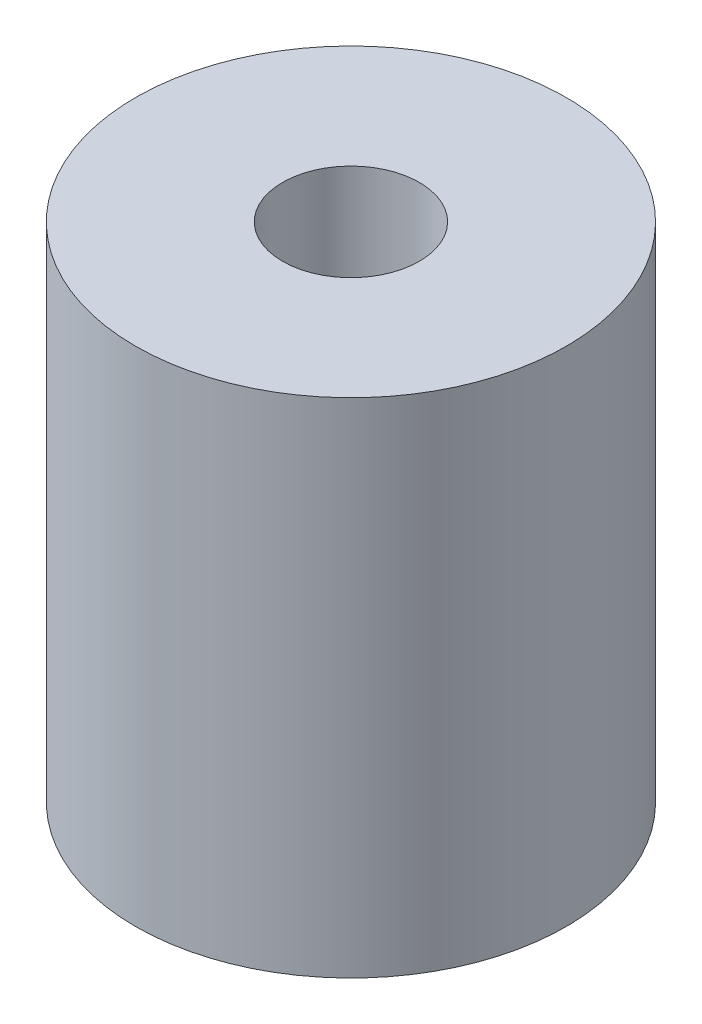
ISO-10303-21;
HEADER;
FILE_DESCRIPTION(('STEP AP214'),'2;1');
FILE_NAME('part.step','',(''),(''),'','','');
FILE_SCHEMA(('AUTOMOTIVE_DESIGN { 1 0 10303 214 1 1 1 1 }'));
ENDSEC;
DATA;
#1=APPLICATION_CONTEXT('core data for automotive mechanical design processes');
#2=APPLICATION_PROTOCOL_DEFINITION('international standard','automotive_design',2000,#1);
#3=PRODUCT_CONTEXT('',#1,'mechanical');
#4=PRODUCT('Part','Part','',(#3));
#5=PRODUCT_RELATED_PRODUCT_CATEGORY('part','',(#4));
#6=PRODUCT_DEFINITION_FORMATION('','',#4);
#7=PRODUCT_DEFINITION_CONTEXT('part definition',#1,'design');
#8=PRODUCT_DEFINITION('design','',#6,#7);
#9=PRODUCT_DEFINITION_SHAPE('','',#8);
#10=(LENGTH_UNIT() NAMED_UNIT(*) SI_UNIT(.MILLI.,.METRE.));
#11=(NAMED_UNIT(*) PLANE_ANGLE_UNIT() SI_UNIT($,.RADIAN.));
#12=(NAMED_UNIT(*) SI_UNIT($,.STERADIAN.) SOLID_ANGLE_UNIT());
#13=UNCERTAINTY_MEASURE_WITH_UNIT(LENGTH_MEASURE(1.E-05),#10,'distance_accuracy_value','');
#14=(GEOMETRIC_REPRESENTATION_CONTEXT(3) GLOBAL_UNCERTAINTY_ASSIGNED_CONTEXT((#13)) GLOBAL_UNIT_ASSIGNED_CONTEXT((#10,
#11,#12)) REPRESENTATION_CONTEXT('',''));
#15=CARTESIAN_POINT('',(0.,0.,0.));
#16=DIRECTION('',(0.,0.,1.));
#17=DIRECTION('',(1.,0.,0.));
#18=AXIS2_PLACEMENT_3D('',#15,#16,#17);
#19=CARTESIAN_POINT('',(0.,35.,0.));
#20=DIRECTION('',(0.,-1.,0.));
#21=DIRECTION('',(0.,0.,-1.));
#22=AXIS2_PLACEMENT_3D('',#19,#20,#21);
#23=CYLINDRICAL_SURFACE('',#22,15.);
#24=CARTESIAN_POINT('',(0.,35.,0.));
#25=DIRECTION('',(0.,1.,0.));
#26=DIRECTION('',(0.,0.,1.));
#27=AXIS2_PLACEMENT_3D('',#24,#25,#26);
#28=CIRCLE('',#27,15.);
#29=CARTESIAN_POINT('',(0.,35.,15.));
#30=VERTEX_POINT('',#29);
#31=EDGE_CURVE('E10',#30,#30,#28,.T.);
#32=ORIENTED_EDGE('',*,*,#31,.F.);
#33=EDGE_LOOP('',(#32));
#34=FACE_BOUND('',#33,.T.);
#35=CARTESIAN_POINT('',(0.,0.,0.));
#36=DIRECTION('',(0.,1.,0.));
#37=DIRECTION('',(0.,0.,1.));
#38=AXIS2_PLACEMENT_3D('',#35,#36,#37);
#39=CIRCLE('',#38,15.);
#40=CARTESIAN_POINT('',(0.,0.,15.));
#41=VERTEX_POINT('',#40);
#42=EDGE_CURVE('E46',#41,#41,#39,.T.);
#43=ORIENTED_EDGE('',*,*,#42,.T.);
#44=EDGE_LOOP('',(#43));
#45=FACE_BOUND('',#44,.T.);
#46=ADVANCED_FACE('F43',(#34,#45),#23,.T.);
#47=CARTESIAN_POINT('',(0.,35.,0.));
#48=DIRECTION('',(0.,1.,0.));
#49=DIRECTION('',(0.,0.,1.));
#50=AXIS2_PLACEMENT_3D('',#47,#48,#49);
#51=PLANE('',#50);
#52=CARTESIAN_POINT('',(0.,35.,0.));
#53=DIRECTION('',(0.,1.,0.));
#54=DIRECTION('',(0.,0.,1.));
#55=AXIS2_PLACEMENT_3D('',#52,#53,#54);
#56=CIRCLE('',#55,4.7625);
#57=CARTESIAN_POINT('',(0.,35.,4.7625));
#58=VERTEX_POINT('',#57);
#59=EDGE_CURVE('E57',#58,#58,#56,.T.);
#60=ORIENTED_EDGE('',*,*,#59,.F.);
#61=EDGE_LOOP('',(#60));
#62=FACE_BOUND('',#61,.T.);
#63=ORIENTED_EDGE('',*,*,#31,.T.);
#64=EDGE_LOOP('',(#63));
#65=FACE_BOUND('',#64,.T.);
#66=ADVANCED_FACE('F86',(#62,#65),#51,.T.);
#67=CARTESIAN_POINT('',(0.,0.,0.));
#68=DIRECTION('',(0.,1.,0.));
#69=DIRECTION('',(0.,0.,1.));
#70=AXIS2_PLACEMENT_3D('',#67,#68,#69);
#71=PLANE('',#70);
#72=CARTESIAN_POINT('',(0.,0.,0.));
#73=DIRECTION('',(0.,-1.,0.));
#74=DIRECTION('',(0.,0.,-1.));
#75=AXIS2_PLACEMENT_3D('',#72,#73,#74);
#76=CIRCLE('',#75,5.);
#77=CARTESIAN_POINT('',(0.,0.,-5.));
#78=VERTEX_POINT('',#77);
#79=EDGE_CURVE('E65',#78,#78,#76,.T.);
#80=ORIENTED_EDGE('',*,*,#79,.F.);
#81=EDGE_LOOP('',(#80));
#82=FACE_BOUND('',#81,.T.);
#83=ORIENTED_EDGE('',*,*,#42,.F.);
#84=EDGE_LOOP('',(#83));
#85=FACE_BOUND('',#84,.T.);
#86=ADVANCED_FACE('F82',(#82,#85),#71,.F.);
#87=CARTESIAN_POINT('',(0.,23.5,0.));
#88=DIRECTION('',(0.,1.,0.));
#89=DIRECTION('',(0.,0.,1.));
#90=AXIS2_PLACEMENT_3D('',#87,#88,#89);
#91=CYLINDRICAL_SURFACE('',#90,4.7625);
#92=CARTESIAN_POINT('',(0.,23.5,0.));
#93=DIRECTION('',(0.,1.,0.));
#94=DIRECTION('',(0.,0.,1.));
#95=AXIS2_PLACEMENT_3D('',#92,#93,#94);
#96=CIRCLE('',#95,4.7625);
#97=CARTESIAN_POINT('',(0.,23.5,4.7625));
#98=VERTEX_POINT('',#97);
#99=EDGE_CURVE('E55',#98,#98,#96,.T.);
#100=ORIENTED_EDGE('',*,*,#99,.F.);
#101=EDGE_LOOP('',(#100));
#102=FACE_BOUND('',#101,.T.);
#103=ORIENTED_EDGE('',*,*,#59,.T.);
#104=EDGE_LOOP('',(#103));
#105=FACE_BOUND('',#104,.T.);
#106=ADVANCED_FACE('F85',(#102,#105),#91,.F.);
#107=CARTESIAN_POINT('',(0.,23.5,0.));
#108=DIRECTION('',(0.,1.,0.));
#109=DIRECTION('',(0.,0.,1.));
#110=AXIS2_PLACEMENT_3D('',#107,#108,#109);
#111=PLANE('',#110);
#112=ORIENTED_EDGE('',*,*,#99,.T.);
#113=EDGE_LOOP('',(#112));
#114=FACE_BOUND('',#113,.T.);
#115=ADVANCED_FACE('F78',(#114),#111,.T.);
#116=CARTESIAN_POINT('',(0.,11.5,0.));
#117=DIRECTION('',(0.,-1.,0.));
#118=DIRECTION('',(0.,0.,-1.));
#119=AXIS2_PLACEMENT_3D('',#116,#117,#118);
#120=CYLINDRICAL_SURFACE('',#119,5.);
#121=CARTESIAN_POINT('',(0.,11.5,0.));
#122=DIRECTION('',(0.,-1.,0.));
#123=DIRECTION('',(0.,0.,-1.));
#124=AXIS2_PLACEMENT_3D('',#121,#122,#123);
#125=CIRCLE('',#124,5.);
#126=CARTESIAN_POINT('',(0.,11.5,-5.));
#127=VERTEX_POINT('',#126);
#128=EDGE_CURVE('E61',#127,#127,#125,.T.);
#129=ORIENTED_EDGE('',*,*,#128,.F.);
#130=EDGE_LOOP('',(#129));
#131=FACE_BOUND('',#130,.T.);
#132=ORIENTED_EDGE('',*,*,#79,.T.);
#133=EDGE_LOOP('',(#132));
#134=FACE_BOUND('',#133,.T.);
#135=ADVANCED_FACE('F75',(#131,#134),#120,.F.);
#136=CARTESIAN_POINT('',(0.,11.5,0.));
#137=DIRECTION('',(0.,-1.,0.));
#138=DIRECTION('',(0.,0.,-1.));
#139=AXIS2_PLACEMENT_3D('',#136,#137,#138);
#140=PLANE('',#139);
#141=ORIENTED_EDGE('',*,*,#128,.T.);
#142=EDGE_LOOP('',(#141));
#143=FACE_BOUND('',#142,.T.);
#144=ADVANCED_FACE('F73',(#143),#140,.T.);
#145=CLOSED_SHELL('',(#46,#66,#86,#106,#115,#135,#144));
#146=MANIFOLD_SOLID_BREP('B2',#145);
#147=ADVANCED_BREP_SHAPE_REPRESENTATION('',(#18,#146),#14);
#148=SHAPE_DEFINITION_REPRESENTATION(#9,#147);
ENDSEC;
END-ISO-10303-21;
